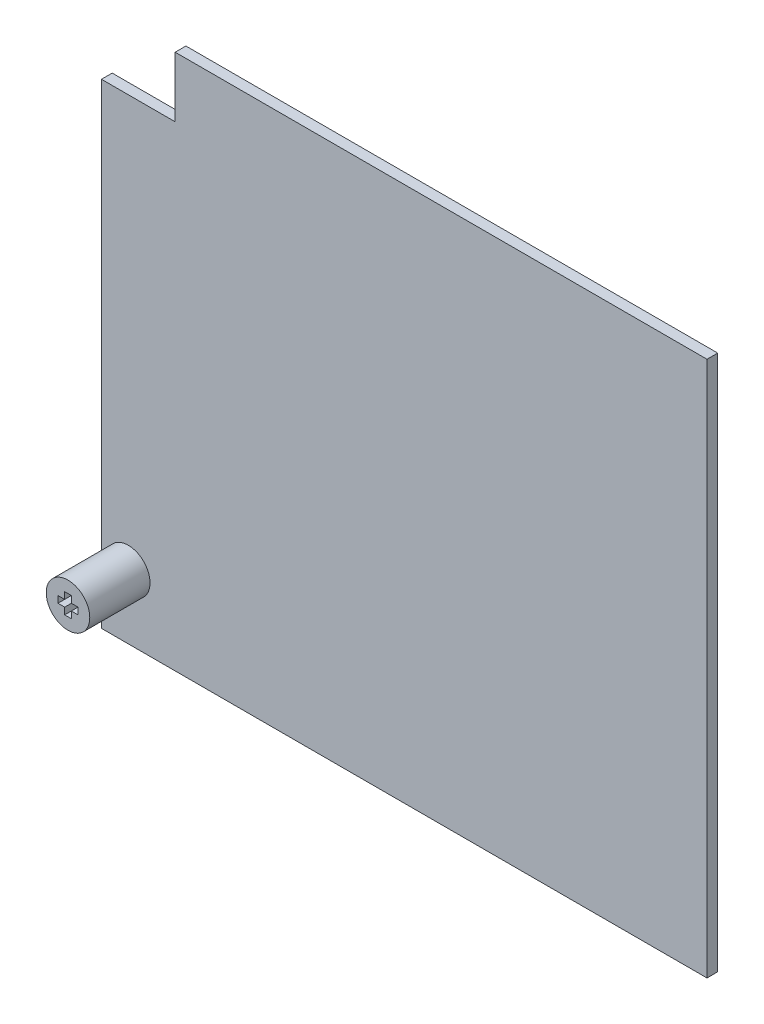
ISO-10303-21;
HEADER;
FILE_DESCRIPTION(('STEP AP214'),'2;1');
FILE_NAME('part.step','',(''),(''),'','','');
FILE_SCHEMA(('AUTOMOTIVE_DESIGN { 1 0 10303 214 1 1 1 1 }'));
ENDSEC;
DATA;
#1=APPLICATION_CONTEXT('core data for automotive mechanical design processes');
#2=APPLICATION_PROTOCOL_DEFINITION('international standard','automotive_design',2000,#1);
#3=PRODUCT_CONTEXT('',#1,'mechanical');
#4=PRODUCT('Part','Part','',(#3));
#5=PRODUCT_RELATED_PRODUCT_CATEGORY('part','',(#4));
#6=PRODUCT_DEFINITION_FORMATION('','',#4);
#7=PRODUCT_DEFINITION_CONTEXT('part definition',#1,'design');
#8=PRODUCT_DEFINITION('design','',#6,#7);
#9=PRODUCT_DEFINITION_SHAPE('','',#8);
#10=(LENGTH_UNIT() NAMED_UNIT(*) SI_UNIT(.MILLI.,.METRE.));
#11=(NAMED_UNIT(*) PLANE_ANGLE_UNIT() SI_UNIT($,.RADIAN.));
#12=(NAMED_UNIT(*) SI_UNIT($,.STERADIAN.) SOLID_ANGLE_UNIT());
#13=UNCERTAINTY_MEASURE_WITH_UNIT(LENGTH_MEASURE(1.E-05),#10,'distance_accuracy_value','');
#14=(GEOMETRIC_REPRESENTATION_CONTEXT(3) GLOBAL_UNCERTAINTY_ASSIGNED_CONTEXT((#13)) GLOBAL_UNIT_ASSIGNED_CONTEXT((#10,
#11,#12)) REPRESENTATION_CONTEXT('',''));
#15=CARTESIAN_POINT('',(0.,0.,0.));
#16=DIRECTION('',(0.,0.,1.));
#17=DIRECTION('',(1.,0.,0.));
#18=AXIS2_PLACEMENT_3D('',#15,#16,#17);
#19=CARTESIAN_POINT('',(5.49999999999999,9.5,18.6));
#20=DIRECTION('',(-1.,0.,0.));
#21=DIRECTION('',(0.,-1.,0.));
#22=AXIS2_PLACEMENT_3D('',#19,#20,#21);
#23=PLANE('',#22);
#24=DIRECTION('',(0.,0.,1.));
#25=VECTOR('',#24,1.);
#26=CARTESIAN_POINT('',(5.49999999999999,9.5,18.6));
#27=LINE('',#26,#25);
#28=CARTESIAN_POINT('',(5.49999999999999,9.5,15.6));
#29=VERTEX_POINT('',#28);
#30=CARTESIAN_POINT('',(5.49999999999999,9.5,12.6));
#31=VERTEX_POINT('',#30);
#32=EDGE_CURVE('E162',#29,#31,#27,.F.);
#33=ORIENTED_EDGE('',*,*,#32,.F.);
#34=DIRECTION('',(0.,-1.,0.));
#35=VECTOR('',#34,1.);
#36=CARTESIAN_POINT('',(5.49999999999999,9.5,15.6));
#37=LINE('',#36,#35);
#38=CARTESIAN_POINT('',(5.49999999999999,10.5,15.6));
#39=VERTEX_POINT('',#38);
#40=EDGE_CURVE('E138',#29,#39,#37,.F.);
#41=ORIENTED_EDGE('',*,*,#40,.T.);
#42=DIRECTION('',(0.,0.,1.));
#43=VECTOR('',#42,1.);
#44=CARTESIAN_POINT('',(5.49999999999999,10.5,18.6));
#45=LINE('',#44,#43);
#46=CARTESIAN_POINT('',(5.49999999999999,10.5,12.6));
#47=VERTEX_POINT('',#46);
#48=EDGE_CURVE('E146',#47,#39,#45,.T.);
#49=ORIENTED_EDGE('',*,*,#48,.F.);
#50=DIRECTION('',(0.,-1.,0.));
#51=VECTOR('',#50,1.);
#52=CARTESIAN_POINT('',(5.49999999999999,9.5,12.6));
#53=LINE('',#52,#51);
#54=EDGE_CURVE('E154',#47,#31,#53,.T.);
#55=ORIENTED_EDGE('',*,*,#54,.T.);
#56=EDGE_LOOP('',(#33,#41,#49,#55));
#57=FACE_BOUND('',#56,.T.);
#58=ADVANCED_FACE('F17',(#57),#23,.T.);
#59=CARTESIAN_POINT('',(3.49999999999998,10.5,18.6));
#60=DIRECTION('',(0.,1.,0.));
#61=DIRECTION('',(0.,0.,1.));
#62=AXIS2_PLACEMENT_3D('',#59,#60,#61);
#63=PLANE('',#62);
#64=DIRECTION('',(1.,0.,0.));
#65=VECTOR('',#64,1.);
#66=CARTESIAN_POINT('',(3.49999999999998,10.5,15.6));
#67=LINE('',#66,#65);
#68=CARTESIAN_POINT('',(6.49999999999999,10.5,15.6));
#69=VERTEX_POINT('',#68);
#70=EDGE_CURVE('E160',#39,#69,#67,.T.);
#71=ORIENTED_EDGE('',*,*,#70,.T.);
#72=DIRECTION('',(0.,0.,-1.));
#73=VECTOR('',#72,1.);
#74=CARTESIAN_POINT('',(6.49999999999999,10.5,18.6));
#75=LINE('',#74,#73);
#76=CARTESIAN_POINT('',(6.49999999999999,10.5,12.6));
#77=VERTEX_POINT('',#76);
#78=EDGE_CURVE('E149',#69,#77,#75,.T.);
#79=ORIENTED_EDGE('',*,*,#78,.T.);
#80=DIRECTION('',(1.,0.,0.));
#81=VECTOR('',#80,1.);
#82=CARTESIAN_POINT('',(3.49999999999998,10.5,12.6));
#83=LINE('',#82,#81);
#84=EDGE_CURVE('E143',#77,#47,#83,.F.);
#85=ORIENTED_EDGE('',*,*,#84,.T.);
#86=ORIENTED_EDGE('',*,*,#48,.T.);
#87=EDGE_LOOP('',(#71,#79,#85,#86));
#88=FACE_BOUND('',#87,.T.);
#89=ADVANCED_FACE('F145',(#88),#63,.T.);
#90=CARTESIAN_POINT('',(4.99999999999999,9.5,18.6));
#91=DIRECTION('',(0.,1.,0.));
#92=DIRECTION('',(-1.,0.,0.));
#93=AXIS2_PLACEMENT_3D('',#90,#91,#92);
#94=PLANE('',#93);
#95=DIRECTION('',(0.,0.,1.));
#96=VECTOR('',#95,1.);
#97=CARTESIAN_POINT('',(4.49999999999998,9.5,18.6));
#98=LINE('',#97,#96);
#99=CARTESIAN_POINT('',(4.49999999999998,9.5,12.6));
#100=VERTEX_POINT('',#99);
#101=CARTESIAN_POINT('',(4.49999999999998,9.5,15.6));
#102=VERTEX_POINT('',#101);
#103=EDGE_CURVE('E243',#100,#102,#98,.T.);
#104=ORIENTED_EDGE('',*,*,#103,.T.);
#105=DIRECTION('',(-1.,0.,0.));
#106=VECTOR('',#105,1.);
#107=CARTESIAN_POINT('',(4.99999999999999,9.5,15.6));
#108=LINE('',#107,#106);
#109=EDGE_CURVE('E254',#102,#29,#108,.F.);
#110=ORIENTED_EDGE('',*,*,#109,.T.);
#111=ORIENTED_EDGE('',*,*,#32,.T.);
#112=DIRECTION('',(-1.,0.,0.));
#113=VECTOR('',#112,1.);
#114=CARTESIAN_POINT('',(4.99999999999999,9.5,12.6));
#115=LINE('',#114,#113);
#116=EDGE_CURVE('E157',#31,#100,#115,.T.);
#117=ORIENTED_EDGE('',*,*,#116,.T.);
#118=EDGE_LOOP('',(#104,#110,#111,#117));
#119=FACE_BOUND('',#118,.T.);
#120=ADVANCED_FACE('F258',(#119),#94,.T.);
#121=CARTESIAN_POINT('',(6.49999999999999,11.,18.6));
#122=DIRECTION('',(1.,0.,0.));
#123=DIRECTION('',(0.,0.,-1.));
#124=AXIS2_PLACEMENT_3D('',#121,#122,#123);
#125=PLANE('',#124);
#126=DIRECTION('',(0.,1.,0.));
#127=VECTOR('',#126,1.);
#128=CARTESIAN_POINT('',(6.49999999999999,11.,12.6));
#129=LINE('',#128,#127);
#130=CARTESIAN_POINT('',(6.49999999999999,11.5,12.6));
#131=VERTEX_POINT('',#130);
#132=EDGE_CURVE('E248',#77,#131,#129,.T.);
#133=ORIENTED_EDGE('',*,*,#132,.F.);
#134=ORIENTED_EDGE('',*,*,#78,.F.);
#135=DIRECTION('',(0.,1.,0.));
#136=VECTOR('',#135,1.);
#137=CARTESIAN_POINT('',(6.49999999999999,11.,15.6));
#138=LINE('',#137,#136);
#139=CARTESIAN_POINT('',(6.49999999999999,11.5,15.6));
#140=VERTEX_POINT('',#139);
#141=EDGE_CURVE('E251',#140,#69,#138,.F.);
#142=ORIENTED_EDGE('',*,*,#141,.F.);
#143=DIRECTION('',(0.,0.,1.));
#144=VECTOR('',#143,1.);
#145=CARTESIAN_POINT('',(6.49999999999999,11.5,18.6));
#146=LINE('',#145,#144);
#147=EDGE_CURVE('E235',#140,#131,#146,.F.);
#148=ORIENTED_EDGE('',*,*,#147,.T.);
#149=EDGE_LOOP('',(#133,#134,#142,#148));
#150=FACE_BOUND('',#149,.T.);
#151=ADVANCED_FACE('F294',(#150),#125,.F.);
#152=CARTESIAN_POINT('',(4.49999999999998,9.5,18.6));
#153=DIRECTION('',(-1.,0.,0.));
#154=DIRECTION('',(0.,-1.,0.));
#155=AXIS2_PLACEMENT_3D('',#152,#153,#154);
#156=PLANE('',#155);
#157=ORIENTED_EDGE('',*,*,#103,.F.);
#158=DIRECTION('',(0.,-1.,0.));
#159=VECTOR('',#158,1.);
#160=CARTESIAN_POINT('',(4.49999999999998,9.5,12.6));
#161=LINE('',#160,#159);
#162=CARTESIAN_POINT('',(4.49999999999998,10.5,12.6));
#163=VERTEX_POINT('',#162);
#164=EDGE_CURVE('E246',#163,#100,#161,.T.);
#165=ORIENTED_EDGE('',*,*,#164,.F.);
#166=DIRECTION('',(0.,0.,1.));
#167=VECTOR('',#166,1.);
#168=CARTESIAN_POINT('',(4.49999999999998,10.5,18.6));
#169=LINE('',#168,#167);
#170=CARTESIAN_POINT('',(4.49999999999998,10.5,15.6));
#171=VERTEX_POINT('',#170);
#172=EDGE_CURVE('E229',#171,#163,#169,.F.);
#173=ORIENTED_EDGE('',*,*,#172,.F.);
#174=DIRECTION('',(0.,-1.,0.));
#175=VECTOR('',#174,1.);
#176=CARTESIAN_POINT('',(4.49999999999998,9.5,15.6));
#177=LINE('',#176,#175);
#178=EDGE_CURVE('E241',#102,#171,#177,.F.);
#179=ORIENTED_EDGE('',*,*,#178,.F.);
#180=EDGE_LOOP('',(#157,#165,#173,#179));
#181=FACE_BOUND('',#180,.T.);
#182=ADVANCED_FACE('F265',(#181),#156,.F.);
#183=CARTESIAN_POINT('',(3.49999999999998,11.5,18.6));
#184=DIRECTION('',(0.,1.,0.));
#185=DIRECTION('',(0.,0.,1.));
#186=AXIS2_PLACEMENT_3D('',#183,#184,#185);
#187=PLANE('',#186);
#188=DIRECTION('',(1.,0.,0.));
#189=VECTOR('',#188,1.);
#190=CARTESIAN_POINT('',(3.49999999999998,11.5,12.6));
#191=LINE('',#190,#189);
#192=CARTESIAN_POINT('',(5.49999999999999,11.5,12.6));
#193=VERTEX_POINT('',#192);
#194=EDGE_CURVE('E232',#131,#193,#191,.F.);
#195=ORIENTED_EDGE('',*,*,#194,.F.);
#196=ORIENTED_EDGE('',*,*,#147,.F.);
#197=DIRECTION('',(1.,0.,0.));
#198=VECTOR('',#197,1.);
#199=CARTESIAN_POINT('',(3.49999999999998,11.5,15.6));
#200=LINE('',#199,#198);
#201=CARTESIAN_POINT('',(5.49999999999999,11.5,15.6));
#202=VERTEX_POINT('',#201);
#203=EDGE_CURVE('E238',#202,#140,#200,.T.);
#204=ORIENTED_EDGE('',*,*,#203,.F.);
#205=DIRECTION('',(0.,0.,1.));
#206=VECTOR('',#205,1.);
#207=CARTESIAN_POINT('',(5.49999999999999,11.5,18.6));
#208=LINE('',#207,#206);
#209=EDGE_CURVE('E219',#193,#202,#208,.T.);
#210=ORIENTED_EDGE('',*,*,#209,.F.);
#211=EDGE_LOOP('',(#195,#196,#204,#210));
#212=FACE_BOUND('',#211,.T.);
#213=ADVANCED_FACE('F291',(#212),#187,.F.);
#214=CARTESIAN_POINT('',(3.49999999999998,10.5,18.6));
#215=DIRECTION('',(0.,1.,0.));
#216=DIRECTION('',(0.,0.,1.));
#217=AXIS2_PLACEMENT_3D('',#214,#215,#216);
#218=PLANE('',#217);
#219=DIRECTION('',(0.,0.,-1.));
#220=VECTOR('',#219,1.);
#221=CARTESIAN_POINT('',(3.49999999999998,10.5,18.6));
#222=LINE('',#221,#220);
#223=CARTESIAN_POINT('',(3.49999999999998,10.5,15.6));
#224=VERTEX_POINT('',#223);
#225=CARTESIAN_POINT('',(3.49999999999998,10.5,12.6));
#226=VERTEX_POINT('',#225);
#227=EDGE_CURVE('E214',#224,#226,#222,.T.);
#228=ORIENTED_EDGE('',*,*,#227,.F.);
#229=DIRECTION('',(1.,0.,0.));
#230=VECTOR('',#229,1.);
#231=CARTESIAN_POINT('',(3.49999999999998,10.5,15.6));
#232=LINE('',#231,#230);
#233=EDGE_CURVE('E224',#224,#171,#232,.T.);
#234=ORIENTED_EDGE('',*,*,#233,.T.);
#235=ORIENTED_EDGE('',*,*,#172,.T.);
#236=DIRECTION('',(1.,0.,0.));
#237=VECTOR('',#236,1.);
#238=CARTESIAN_POINT('',(3.49999999999998,10.5,12.6));
#239=LINE('',#238,#237);
#240=EDGE_CURVE('E227',#163,#226,#239,.F.);
#241=ORIENTED_EDGE('',*,*,#240,.T.);
#242=EDGE_LOOP('',(#228,#234,#235,#241));
#243=FACE_BOUND('',#242,.T.);
#244=ADVANCED_FACE('F269',(#243),#218,.T.);
#245=CARTESIAN_POINT('',(5.49999999999999,9.5,18.6));
#246=DIRECTION('',(-1.,0.,0.));
#247=DIRECTION('',(0.,-1.,0.));
#248=AXIS2_PLACEMENT_3D('',#245,#246,#247);
#249=PLANE('',#248);
#250=ORIENTED_EDGE('',*,*,#209,.T.);
#251=DIRECTION('',(0.,-1.,0.));
#252=VECTOR('',#251,1.);
#253=CARTESIAN_POINT('',(5.49999999999999,9.5,15.6));
#254=LINE('',#253,#252);
#255=CARTESIAN_POINT('',(5.49999999999999,12.5,15.6));
#256=VERTEX_POINT('',#255);
#257=EDGE_CURVE('E217',#202,#256,#254,.F.);
#258=ORIENTED_EDGE('',*,*,#257,.T.);
#259=DIRECTION('',(0.,0.,1.));
#260=VECTOR('',#259,1.);
#261=CARTESIAN_POINT('',(5.49999999999999,12.5,18.6));
#262=LINE('',#261,#260);
#263=CARTESIAN_POINT('',(5.49999999999999,12.5,12.6));
#264=VERTEX_POINT('',#263);
#265=EDGE_CURVE('E206',#256,#264,#262,.F.);
#266=ORIENTED_EDGE('',*,*,#265,.T.);
#267=DIRECTION('',(0.,-1.,0.));
#268=VECTOR('',#267,1.);
#269=CARTESIAN_POINT('',(5.49999999999999,9.5,12.6));
#270=LINE('',#269,#268);
#271=EDGE_CURVE('E222',#264,#193,#270,.T.);
#272=ORIENTED_EDGE('',*,*,#271,.T.);
#273=EDGE_LOOP('',(#250,#258,#266,#272));
#274=FACE_BOUND('',#273,.T.);
#275=ADVANCED_FACE('F287',(#274),#249,.T.);
#276=CARTESIAN_POINT('',(3.49999999999998,11.,18.6));
#277=DIRECTION('',(1.,0.,0.));
#278=DIRECTION('',(0.,0.,-1.));
#279=AXIS2_PLACEMENT_3D('',#276,#277,#278);
#280=PLANE('',#279);
#281=DIRECTION('',(0.,0.,1.));
#282=VECTOR('',#281,1.);
#283=CARTESIAN_POINT('',(3.49999999999998,11.5,18.6));
#284=LINE('',#283,#282);
#285=CARTESIAN_POINT('',(3.49999999999998,11.5,12.6));
#286=VERTEX_POINT('',#285);
#287=CARTESIAN_POINT('',(3.49999999999998,11.5,15.6));
#288=VERTEX_POINT('',#287);
#289=EDGE_CURVE('E198',#286,#288,#284,.T.);
#290=ORIENTED_EDGE('',*,*,#289,.T.);
#291=DIRECTION('',(0.,1.,0.));
#292=VECTOR('',#291,1.);
#293=CARTESIAN_POINT('',(3.49999999999998,11.,15.6));
#294=LINE('',#293,#292);
#295=EDGE_CURVE('E211',#288,#224,#294,.F.);
#296=ORIENTED_EDGE('',*,*,#295,.T.);
#297=ORIENTED_EDGE('',*,*,#227,.T.);
#298=DIRECTION('',(0.,1.,0.));
#299=VECTOR('',#298,1.);
#300=CARTESIAN_POINT('',(3.49999999999998,11.,12.6));
#301=LINE('',#300,#299);
#302=EDGE_CURVE('E201',#286,#226,#301,.F.);
#303=ORIENTED_EDGE('',*,*,#302,.F.);
#304=EDGE_LOOP('',(#290,#296,#297,#303));
#305=FACE_BOUND('',#304,.T.);
#306=ADVANCED_FACE('F272',(#305),#280,.T.);
#307=CARTESIAN_POINT('',(4.99999999999999,12.5,18.6));
#308=DIRECTION('',(0.,1.,0.));
#309=DIRECTION('',(-1.,0.,0.));
#310=AXIS2_PLACEMENT_3D('',#307,#308,#309);
#311=PLANE('',#310);
#312=DIRECTION('',(1.,0.,0.));
#313=VECTOR('',#312,1.);
#314=CARTESIAN_POINT('',(3.49999999999998,12.5,12.6));
#315=LINE('',#314,#313);
#316=CARTESIAN_POINT('',(4.49999999999999,12.5,12.6));
#317=VERTEX_POINT('',#316);
#318=EDGE_CURVE('E204',#264,#317,#315,.F.);
#319=ORIENTED_EDGE('',*,*,#318,.F.);
#320=ORIENTED_EDGE('',*,*,#265,.F.);
#321=DIRECTION('',(-1.,0.,0.));
#322=VECTOR('',#321,1.);
#323=CARTESIAN_POINT('',(4.99999999999999,12.5,15.6));
#324=LINE('',#323,#322);
#325=CARTESIAN_POINT('',(4.49999999999999,12.5,15.6));
#326=VERTEX_POINT('',#325);
#327=EDGE_CURVE('E209',#326,#256,#324,.F.);
#328=ORIENTED_EDGE('',*,*,#327,.F.);
#329=DIRECTION('',(0.,0.,1.));
#330=VECTOR('',#329,1.);
#331=CARTESIAN_POINT('',(4.49999999999998,12.5,18.6));
#332=LINE('',#331,#330);
#333=EDGE_CURVE('E190',#326,#317,#332,.F.);
#334=ORIENTED_EDGE('',*,*,#333,.T.);
#335=EDGE_LOOP('',(#319,#320,#328,#334));
#336=FACE_BOUND('',#335,.T.);
#337=ADVANCED_FACE('F283',(#336),#311,.F.);
#338=CARTESIAN_POINT('',(3.49999999999998,11.,12.6));
#339=DIRECTION('',(0.,0.,1.));
#340=DIRECTION('',(1.,0.,0.));
#341=AXIS2_PLACEMENT_3D('',#338,#339,#340);
#342=PLANE('',#341);
#343=ORIENTED_EDGE('',*,*,#84,.F.);
#344=ORIENTED_EDGE('',*,*,#132,.T.);
#345=ORIENTED_EDGE('',*,*,#194,.T.);
#346=ORIENTED_EDGE('',*,*,#271,.F.);
#347=ORIENTED_EDGE('',*,*,#318,.T.);
#348=DIRECTION('',(0.,-1.,0.));
#349=VECTOR('',#348,1.);
#350=CARTESIAN_POINT('',(4.49999999999998,9.5,12.6));
#351=LINE('',#350,#349);
#352=CARTESIAN_POINT('',(4.49999999999999,11.5,12.6));
#353=VERTEX_POINT('',#352);
#354=EDGE_CURVE('E184',#317,#353,#351,.T.);
#355=ORIENTED_EDGE('',*,*,#354,.T.);
#356=DIRECTION('',(1.,0.,0.));
#357=VECTOR('',#356,1.);
#358=CARTESIAN_POINT('',(3.49999999999998,11.5,12.6));
#359=LINE('',#358,#357);
#360=EDGE_CURVE('E193',#353,#286,#359,.F.);
#361=ORIENTED_EDGE('',*,*,#360,.T.);
#362=ORIENTED_EDGE('',*,*,#302,.T.);
#363=ORIENTED_EDGE('',*,*,#240,.F.);
#364=ORIENTED_EDGE('',*,*,#164,.T.);
#365=ORIENTED_EDGE('',*,*,#116,.F.);
#366=ORIENTED_EDGE('',*,*,#54,.F.);
#367=EDGE_LOOP('',(#343,#344,#345,#346,#347,#355,#361,#362,#363,#364,#365,#366));
#368=FACE_BOUND('',#367,.T.);
#369=ADVANCED_FACE('F155',(#368),#342,.T.);
#370=CARTESIAN_POINT('',(3.49999999999998,11.5,18.6));
#371=DIRECTION('',(0.,1.,0.));
#372=DIRECTION('',(0.,0.,1.));
#373=AXIS2_PLACEMENT_3D('',#370,#371,#372);
#374=PLANE('',#373);
#375=DIRECTION('',(0.,0.,1.));
#376=VECTOR('',#375,1.);
#377=CARTESIAN_POINT('',(4.49999999999998,11.5,18.6));
#378=LINE('',#377,#376);
#379=CARTESIAN_POINT('',(4.49999999999999,11.5,15.6));
#380=VERTEX_POINT('',#379);
#381=EDGE_CURVE('E178',#353,#380,#378,.T.);
#382=ORIENTED_EDGE('',*,*,#381,.T.);
#383=DIRECTION('',(1.,0.,0.));
#384=VECTOR('',#383,1.);
#385=CARTESIAN_POINT('',(3.49999999999998,11.5,15.6));
#386=LINE('',#385,#384);
#387=EDGE_CURVE('E196',#288,#380,#386,.T.);
#388=ORIENTED_EDGE('',*,*,#387,.F.);
#389=ORIENTED_EDGE('',*,*,#289,.F.);
#390=ORIENTED_EDGE('',*,*,#360,.F.);
#391=EDGE_LOOP('',(#382,#388,#389,#390));
#392=FACE_BOUND('',#391,.T.);
#393=ADVANCED_FACE('F275',(#392),#374,.F.);
#394=CARTESIAN_POINT('',(4.49999999999998,9.5,18.6));
#395=DIRECTION('',(-1.,0.,0.));
#396=DIRECTION('',(0.,-1.,0.));
#397=AXIS2_PLACEMENT_3D('',#394,#395,#396);
#398=PLANE('',#397);
#399=ORIENTED_EDGE('',*,*,#381,.F.);
#400=ORIENTED_EDGE('',*,*,#354,.F.);
#401=ORIENTED_EDGE('',*,*,#333,.F.);
#402=DIRECTION('',(0.,1.,0.));
#403=VECTOR('',#402,1.);
#404=CARTESIAN_POINT('',(4.49999999999999,11.,15.6));
#405=LINE('',#404,#403);
#406=EDGE_CURVE('E174',#380,#326,#405,.T.);
#407=ORIENTED_EDGE('',*,*,#406,.F.);
#408=EDGE_LOOP('',(#399,#400,#401,#407));
#409=FACE_BOUND('',#408,.T.);
#410=ADVANCED_FACE('F280',(#409),#398,.F.);
#411=CARTESIAN_POINT('',(4.99999999999999,11.,15.6));
#412=DIRECTION('',(0.,0.,1.));
#413=DIRECTION('',(1.,0.,0.));
#414=AXIS2_PLACEMENT_3D('',#411,#412,#413);
#415=PLANE('',#414);
#416=ORIENTED_EDGE('',*,*,#387,.T.);
#417=ORIENTED_EDGE('',*,*,#406,.T.);
#418=ORIENTED_EDGE('',*,*,#327,.T.);
#419=ORIENTED_EDGE('',*,*,#257,.F.);
#420=ORIENTED_EDGE('',*,*,#203,.T.);
#421=ORIENTED_EDGE('',*,*,#141,.T.);
#422=ORIENTED_EDGE('',*,*,#70,.F.);
#423=ORIENTED_EDGE('',*,*,#40,.F.);
#424=ORIENTED_EDGE('',*,*,#109,.F.);
#425=ORIENTED_EDGE('',*,*,#178,.T.);
#426=ORIENTED_EDGE('',*,*,#233,.F.);
#427=ORIENTED_EDGE('',*,*,#295,.F.);
#428=EDGE_LOOP('',(#416,#417,#418,#419,#420,#421,#422,#423,#424,#425,#426,#427));
#429=FACE_BOUND('',#428,.T.);
#430=CARTESIAN_POINT('',(4.99999999999999,11.,15.6));
#431=DIRECTION('',(0.,0.,1.));
#432=DIRECTION('',(1.,0.,0.));
#433=AXIS2_PLACEMENT_3D('',#430,#431,#432);
#434=CIRCLE('',#433,3.25);
#435=CARTESIAN_POINT('',(8.24999999999999,11.,15.6));
#436=VERTEX_POINT('',#435);
#437=EDGE_CURVE('E20',#436,#436,#434,.F.);
#438=ORIENTED_EDGE('',*,*,#437,.F.);
#439=EDGE_LOOP('',(#438));
#440=FACE_BOUND('',#439,.T.);
#441=ADVANCED_FACE('F261',(#429,#440),#415,.T.);
#442=CARTESIAN_POINT('',(4.99999999999999,11.,6.1));
#443=DIRECTION('',(0.,0.,1.));
#444=DIRECTION('',(1.,0.,0.));
#445=AXIS2_PLACEMENT_3D('',#442,#443,#444);
#446=CYLINDRICAL_SURFACE('',#445,3.25);
#447=ORIENTED_EDGE('',*,*,#437,.T.);
#448=EDGE_LOOP('',(#447));
#449=FACE_BOUND('',#448,.T.);
#450=CARTESIAN_POINT('',(4.99999999999999,11.,6.6));
#451=DIRECTION('',(0.,0.,1.));
#452=DIRECTION('',(1.,0.,0.));
#453=AXIS2_PLACEMENT_3D('',#450,#451,#452);
#454=CIRCLE('',#453,3.25);
#455=CARTESIAN_POINT('',(8.24999999999999,11.,6.6));
#456=VERTEX_POINT('',#455);
#457=EDGE_CURVE('E166',#456,#456,#454,.F.);
#458=ORIENTED_EDGE('',*,*,#457,.F.);
#459=EDGE_LOOP('',(#458));
#460=FACE_BOUND('',#459,.T.);
#461=ADVANCED_FACE('F338',(#449,#460),#446,.T.);
#462=CARTESIAN_POINT('',(0.,0.,6.6));
#463=DIRECTION('',(0.,0.,1.));
#464=DIRECTION('',(1.,0.,0.));
#465=AXIS2_PLACEMENT_3D('',#462,#463,#464);
#466=PLANE('',#465);
#467=DIRECTION('',(-1.,0.,0.));
#468=VECTOR('',#467,1.);
#469=CARTESIAN_POINT('',(12.,81.5,6.6));
#470=LINE('',#469,#468);
#471=CARTESIAN_POINT('',(12.,81.5,6.6));
#472=VERTEX_POINT('',#471);
#473=CARTESIAN_POINT('',(91.4,81.5,6.6));
#474=VERTEX_POINT('',#473);
#475=EDGE_CURVE('E506',#472,#474,#470,.F.);
#476=ORIENTED_EDGE('',*,*,#475,.F.);
#477=DIRECTION('',(0.,1.,0.));
#478=VECTOR('',#477,1.);
#479=CARTESIAN_POINT('',(12.,72.5,6.6));
#480=LINE('',#479,#478);
#481=CARTESIAN_POINT('',(12.,72.5,6.6));
#482=VERTEX_POINT('',#481);
#483=EDGE_CURVE('E509',#482,#472,#480,.T.);
#484=ORIENTED_EDGE('',*,*,#483,.F.);
#485=DIRECTION('',(1.,0.,0.));
#486=VECTOR('',#485,1.);
#487=CARTESIAN_POINT('',(0.999999999999986,72.5,6.6));
#488=LINE('',#487,#486);
#489=CARTESIAN_POINT('',(0.999999999999986,72.5,6.6));
#490=VERTEX_POINT('',#489);
#491=EDGE_CURVE('E524',#490,#482,#488,.T.);
#492=ORIENTED_EDGE('',*,*,#491,.F.);
#493=DIRECTION('',(0.,1.,0.));
#494=VECTOR('',#493,1.);
#495=CARTESIAN_POINT('',(0.999999999999986,1.49999999999999,6.6));
#496=LINE('',#495,#494);
#497=CARTESIAN_POINT('',(0.999999999999986,1.49999999999997,6.6));
#498=VERTEX_POINT('',#497);
#499=EDGE_CURVE('E168',#498,#490,#496,.T.);
#500=ORIENTED_EDGE('',*,*,#499,.F.);
#501=DIRECTION('',(1.,0.,0.));
#502=VECTOR('',#501,1.);
#503=CARTESIAN_POINT('',(91.4,1.49999999999997,6.6));
#504=LINE('',#503,#502);
#505=CARTESIAN_POINT('',(91.4,1.49999999999997,6.6));
#506=VERTEX_POINT('',#505);
#507=EDGE_CURVE('E171',#506,#498,#504,.F.);
#508=ORIENTED_EDGE('',*,*,#507,.F.);
#509=DIRECTION('',(0.,1.,0.));
#510=VECTOR('',#509,1.);
#511=CARTESIAN_POINT('',(91.4,81.5,6.6));
#512=LINE('',#511,#510);
#513=EDGE_CURVE('E511',#474,#506,#512,.F.);
#514=ORIENTED_EDGE('',*,*,#513,.F.);
#515=EDGE_LOOP('',(#476,#484,#492,#500,#508,#514));
#516=FACE_BOUND('',#515,.T.);
#517=ORIENTED_EDGE('',*,*,#457,.T.);
#518=EDGE_LOOP('',(#517));
#519=FACE_BOUND('',#518,.T.);
#520=ADVANCED_FACE('F334',(#516,#519),#466,.T.);
#521=CARTESIAN_POINT('',(0.999999999999986,1.49999999999999,6.6));
#522=DIRECTION('',(-1.,0.,0.));
#523=DIRECTION('',(0.,0.,1.));
#524=AXIS2_PLACEMENT_3D('',#521,#522,#523);
#525=PLANE('',#524);
#526=ORIENTED_EDGE('',*,*,#499,.T.);
#527=DIRECTION('',(0.,0.,1.));
#528=VECTOR('',#527,1.);
#529=CARTESIAN_POINT('',(0.999999999999986,72.5,6.6));
#530=LINE('',#529,#528);
#531=CARTESIAN_POINT('',(0.999999999999986,72.5,5.));
#532=VERTEX_POINT('',#531);
#533=EDGE_CURVE('E521',#532,#490,#530,.T.);
#534=ORIENTED_EDGE('',*,*,#533,.F.);
#535=DIRECTION('',(0.,1.,0.));
#536=VECTOR('',#535,1.);
#537=CARTESIAN_POINT('',(0.999999999999986,0.,5.));
#538=LINE('',#537,#536);
#539=CARTESIAN_POINT('',(0.999999999999986,1.49999999999997,5.));
#540=VERTEX_POINT('',#539);
#541=EDGE_CURVE('E540',#532,#540,#538,.F.);
#542=ORIENTED_EDGE('',*,*,#541,.T.);
#543=DIRECTION('',(0.,0.,-1.));
#544=VECTOR('',#543,1.);
#545=CARTESIAN_POINT('',(0.999999999999987,1.49999999999997,6.6));
#546=LINE('',#545,#544);
#547=EDGE_CURVE('E532',#498,#540,#546,.T.);
#548=ORIENTED_EDGE('',*,*,#547,.F.);
#549=EDGE_LOOP('',(#526,#534,#542,#548));
#550=FACE_BOUND('',#549,.T.);
#551=ADVANCED_FACE('F330',(#550),#525,.T.);
#552=CARTESIAN_POINT('',(91.4,1.49999999999997,6.6));
#553=DIRECTION('',(0.,-1.,0.));
#554=DIRECTION('',(0.,0.,-1.));
#555=AXIS2_PLACEMENT_3D('',#552,#553,#554);
#556=PLANE('',#555);
#557=ORIENTED_EDGE('',*,*,#507,.T.);
#558=ORIENTED_EDGE('',*,*,#547,.T.);
#559=DIRECTION('',(1.,0.,0.));
#560=VECTOR('',#559,1.);
#561=CARTESIAN_POINT('',(0.,1.49999999999997,5.));
#562=LINE('',#561,#560);
#563=CARTESIAN_POINT('',(91.4,1.49999999999997,5.));
#564=VERTEX_POINT('',#563);
#565=EDGE_CURVE('E541',#540,#564,#562,.T.);
#566=ORIENTED_EDGE('',*,*,#565,.T.);
#567=DIRECTION('',(0.,0.,-1.));
#568=VECTOR('',#567,1.);
#569=CARTESIAN_POINT('',(91.4,1.49999999999997,6.6));
#570=LINE('',#569,#568);
#571=EDGE_CURVE('E514',#506,#564,#570,.T.);
#572=ORIENTED_EDGE('',*,*,#571,.F.);
#573=EDGE_LOOP('',(#557,#558,#566,#572));
#574=FACE_BOUND('',#573,.T.);
#575=ADVANCED_FACE('F326',(#574),#556,.T.);
#576=CARTESIAN_POINT('',(91.4,81.5,6.6));
#577=DIRECTION('',(1.,0.,0.));
#578=DIRECTION('',(0.,0.,-1.));
#579=AXIS2_PLACEMENT_3D('',#576,#577,#578);
#580=PLANE('',#579);
#581=ORIENTED_EDGE('',*,*,#513,.T.);
#582=ORIENTED_EDGE('',*,*,#571,.T.);
#583=DIRECTION('',(0.,1.,0.));
#584=VECTOR('',#583,1.);
#585=CARTESIAN_POINT('',(91.4,0.,5.));
#586=LINE('',#585,#584);
#587=CARTESIAN_POINT('',(91.4,81.5,5.));
#588=VERTEX_POINT('',#587);
#589=EDGE_CURVE('E543',#564,#588,#586,.T.);
#590=ORIENTED_EDGE('',*,*,#589,.T.);
#591=DIRECTION('',(0.,0.,1.));
#592=VECTOR('',#591,1.);
#593=CARTESIAN_POINT('',(91.4,81.5,6.6));
#594=LINE('',#593,#592);
#595=EDGE_CURVE('E513',#474,#588,#594,.F.);
#596=ORIENTED_EDGE('',*,*,#595,.F.);
#597=EDGE_LOOP('',(#581,#582,#590,#596));
#598=FACE_BOUND('',#597,.T.);
#599=ADVANCED_FACE('F322',(#598),#580,.T.);
#600=CARTESIAN_POINT('',(12.,81.5,6.6));
#601=DIRECTION('',(0.,1.,0.));
#602=DIRECTION('',(-1.,0.,0.));
#603=AXIS2_PLACEMENT_3D('',#600,#601,#602);
#604=PLANE('',#603);
#605=ORIENTED_EDGE('',*,*,#475,.T.);
#606=ORIENTED_EDGE('',*,*,#595,.T.);
#607=DIRECTION('',(1.,0.,0.));
#608=VECTOR('',#607,1.);
#609=CARTESIAN_POINT('',(0.,81.5,5.));
#610=LINE('',#609,#608);
#611=CARTESIAN_POINT('',(12.,81.5,5.));
#612=VERTEX_POINT('',#611);
#613=EDGE_CURVE('E519',#588,#612,#610,.F.);
#614=ORIENTED_EDGE('',*,*,#613,.T.);
#615=DIRECTION('',(0.,0.,1.));
#616=VECTOR('',#615,1.);
#617=CARTESIAN_POINT('',(12.,81.5,6.6));
#618=LINE('',#617,#616);
#619=EDGE_CURVE('E517',#472,#612,#618,.F.);
#620=ORIENTED_EDGE('',*,*,#619,.F.);
#621=EDGE_LOOP('',(#605,#606,#614,#620));
#622=FACE_BOUND('',#621,.T.);
#623=ADVANCED_FACE('F318',(#622),#604,.T.);
#624=CARTESIAN_POINT('',(12.,72.5,6.6));
#625=DIRECTION('',(-1.,0.,0.));
#626=DIRECTION('',(0.,0.,1.));
#627=AXIS2_PLACEMENT_3D('',#624,#625,#626);
#628=PLANE('',#627);
#629=ORIENTED_EDGE('',*,*,#483,.T.);
#630=ORIENTED_EDGE('',*,*,#619,.T.);
#631=DIRECTION('',(0.,1.,0.));
#632=VECTOR('',#631,1.);
#633=CARTESIAN_POINT('',(12.,0.,5.));
#634=LINE('',#633,#632);
#635=CARTESIAN_POINT('',(12.,72.5,5.));
#636=VERTEX_POINT('',#635);
#637=EDGE_CURVE('E26',#612,#636,#634,.F.);
#638=ORIENTED_EDGE('',*,*,#637,.T.);
#639=DIRECTION('',(0.,0.,1.));
#640=VECTOR('',#639,1.);
#641=CARTESIAN_POINT('',(12.,72.5,6.6));
#642=LINE('',#641,#640);
#643=EDGE_CURVE('E34',#482,#636,#642,.F.);
#644=ORIENTED_EDGE('',*,*,#643,.F.);
#645=EDGE_LOOP('',(#629,#630,#638,#644));
#646=FACE_BOUND('',#645,.T.);
#647=ADVANCED_FACE('F312',(#646),#628,.T.);
#648=CARTESIAN_POINT('',(0.999999999999986,72.5,6.6));
#649=DIRECTION('',(0.,1.,0.));
#650=DIRECTION('',(0.,0.,1.));
#651=AXIS2_PLACEMENT_3D('',#648,#649,#650);
#652=PLANE('',#651);
#653=ORIENTED_EDGE('',*,*,#491,.T.);
#654=ORIENTED_EDGE('',*,*,#643,.T.);
#655=DIRECTION('',(1.,0.,0.));
#656=VECTOR('',#655,1.);
#657=CARTESIAN_POINT('',(0.,72.5,5.));
#658=LINE('',#657,#656);
#659=EDGE_CURVE('E11',#636,#532,#658,.F.);
#660=ORIENTED_EDGE('',*,*,#659,.T.);
#661=ORIENTED_EDGE('',*,*,#533,.T.);
#662=EDGE_LOOP('',(#653,#654,#660,#661));
#663=FACE_BOUND('',#662,.T.);
#664=ADVANCED_FACE('F306',(#663),#652,.T.);
#665=CARTESIAN_POINT('',(0.,0.,5.));
#666=DIRECTION('',(0.,0.,1.));
#667=DIRECTION('',(1.,0.,0.));
#668=AXIS2_PLACEMENT_3D('',#665,#666,#667);
#669=PLANE('',#668);
#670=ORIENTED_EDGE('',*,*,#637,.F.);
#671=ORIENTED_EDGE('',*,*,#613,.F.);
#672=ORIENTED_EDGE('',*,*,#589,.F.);
#673=ORIENTED_EDGE('',*,*,#565,.F.);
#674=ORIENTED_EDGE('',*,*,#541,.F.);
#675=ORIENTED_EDGE('',*,*,#659,.F.);
#676=EDGE_LOOP('',(#670,#671,#672,#673,#674,#675));
#677=FACE_BOUND('',#676,.T.);
#678=ADVANCED_FACE('F304',(#677),#669,.F.);
#679=CLOSED_SHELL('',(#58,#89,#120,#151,#182,#213,#244,#275,#306,#337,#369,#393,#410,#441,#461,
#520,#551,#575,#599,#623,#647,#664,#678));
#680=MANIFOLD_SOLID_BREP('B1',#679);
#681=ADVANCED_BREP_SHAPE_REPRESENTATION('',(#18,#680),#14);
#682=SHAPE_DEFINITION_REPRESENTATION(#9,#681);
ENDSEC;
END-ISO-10303-21;
